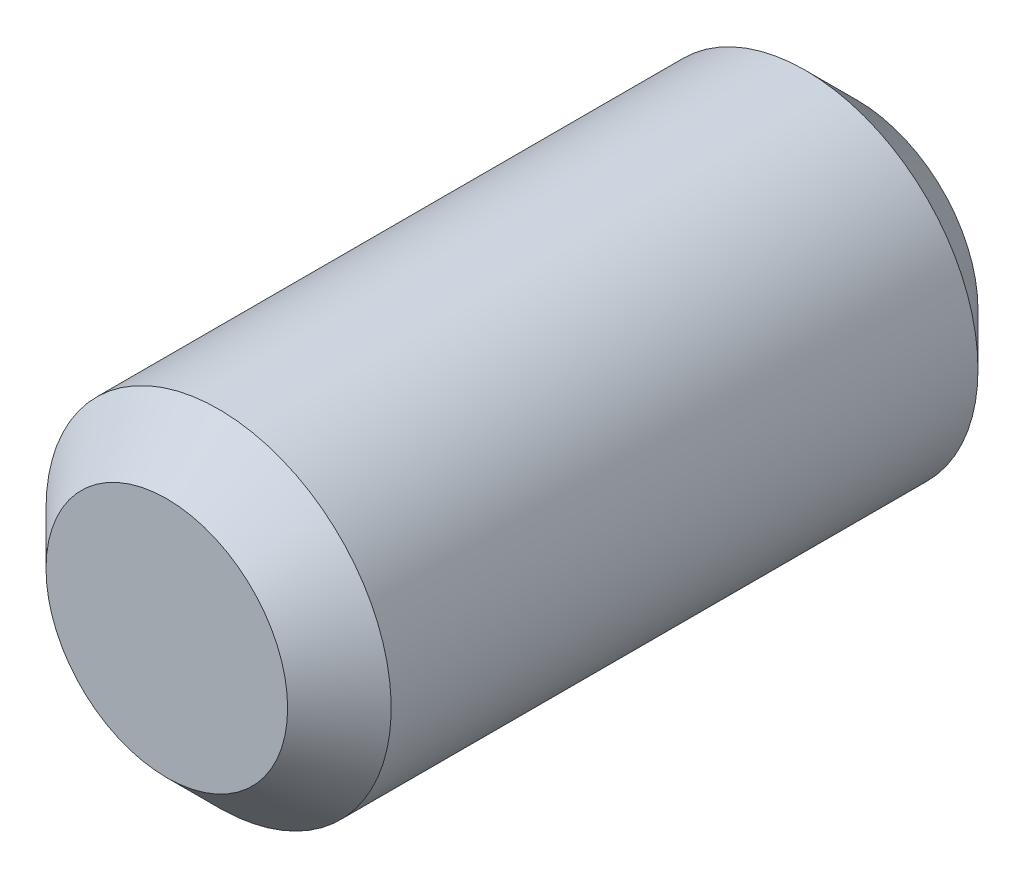
ISO-10303-21;
HEADER;
FILE_DESCRIPTION(('STEP AP214'),'2;1');
FILE_NAME('part.step','',(''),(''),'','','');
FILE_SCHEMA(('AUTOMOTIVE_DESIGN { 1 0 10303 214 1 1 1 1 }'));
ENDSEC;
DATA;
#1=APPLICATION_CONTEXT('core data for automotive mechanical design processes');
#2=APPLICATION_PROTOCOL_DEFINITION('international standard','automotive_design',2000,#1);
#3=PRODUCT_CONTEXT('',#1,'mechanical');
#4=PRODUCT('Part','Part','',(#3));
#5=PRODUCT_RELATED_PRODUCT_CATEGORY('part','',(#4));
#6=PRODUCT_DEFINITION_FORMATION('','',#4);
#7=PRODUCT_DEFINITION_CONTEXT('part definition',#1,'design');
#8=PRODUCT_DEFINITION('design','',#6,#7);
#9=PRODUCT_DEFINITION_SHAPE('','',#8);
#10=(LENGTH_UNIT() NAMED_UNIT(*) SI_UNIT(.MILLI.,.METRE.));
#11=(NAMED_UNIT(*) PLANE_ANGLE_UNIT() SI_UNIT($,.RADIAN.));
#12=(NAMED_UNIT(*) SI_UNIT($,.STERADIAN.) SOLID_ANGLE_UNIT());
#13=UNCERTAINTY_MEASURE_WITH_UNIT(LENGTH_MEASURE(1.E-05),#10,'distance_accuracy_value','');
#14=(GEOMETRIC_REPRESENTATION_CONTEXT(3) GLOBAL_UNCERTAINTY_ASSIGNED_CONTEXT((#13)) GLOBAL_UNIT_ASSIGNED_CONTEXT((#10,
#11,#12)) REPRESENTATION_CONTEXT('',''));
#15=CARTESIAN_POINT('',(0.,0.,0.));
#16=DIRECTION('',(0.,0.,1.));
#17=DIRECTION('',(1.,0.,0.));
#18=AXIS2_PLACEMENT_3D('',#15,#16,#17);
#19=CARTESIAN_POINT('',(0.,0.,4.));
#20=DIRECTION('',(0.,0.,-1.));
#21=DIRECTION('',(-1.,0.,0.));
#22=AXIS2_PLACEMENT_3D('',#19,#20,#21);
#23=CYLINDRICAL_SURFACE('',#22,1.);
#24=CARTESIAN_POINT('',(0.,0.,0.3));
#25=DIRECTION('',(0.,0.,1.));
#26=DIRECTION('',(1.,0.,0.));
#27=AXIS2_PLACEMENT_3D('',#24,#25,#26);
#28=CIRCLE('',#27,1.);
#29=CARTESIAN_POINT('',(1.,0.,0.3));
#30=VERTEX_POINT('',#29);
#31=EDGE_CURVE('E47',#30,#30,#28,.T.);
#32=ORIENTED_EDGE('',*,*,#31,.T.);
#33=EDGE_LOOP('',(#32));
#34=FACE_BOUND('',#33,.T.);
#35=CARTESIAN_POINT('',(0.,0.,3.7));
#36=DIRECTION('',(0.,0.,1.));
#37=DIRECTION('',(1.,0.,0.));
#38=AXIS2_PLACEMENT_3D('',#35,#36,#37);
#39=CIRCLE('',#38,1.);
#40=CARTESIAN_POINT('',(-1.,0.,3.7));
#41=VERTEX_POINT('',#40);
#42=EDGE_CURVE('E51',#41,#41,#39,.F.);
#43=ORIENTED_EDGE('',*,*,#42,.T.);
#44=EDGE_LOOP('',(#43));
#45=FACE_BOUND('',#44,.T.);
#46=ADVANCED_FACE('F35',(#34,#45),#23,.T.);
#47=CARTESIAN_POINT('',(0.,0.,4.));
#48=DIRECTION('',(0.,0.,1.));
#49=DIRECTION('',(1.,0.,0.));
#50=AXIS2_PLACEMENT_3D('',#47,#48,#49);
#51=PLANE('',#50);
#52=CARTESIAN_POINT('',(0.,0.,4.));
#53=DIRECTION('',(0.,0.,1.));
#54=DIRECTION('',(1.,0.,0.));
#55=AXIS2_PLACEMENT_3D('',#52,#53,#54);
#56=CIRCLE('',#55,0.700000000000001);
#57=CARTESIAN_POINT('',(-0.700000000000001,0.,4.));
#58=VERTEX_POINT('',#57);
#59=EDGE_CURVE('E10',#58,#58,#56,.T.);
#60=ORIENTED_EDGE('',*,*,#59,.T.);
#61=EDGE_LOOP('',(#60));
#62=FACE_BOUND('',#61,.T.);
#63=ADVANCED_FACE('F67',(#62),#51,.T.);
#64=CARTESIAN_POINT('',(0.,0.,0.));
#65=DIRECTION('',(0.,0.,1.));
#66=DIRECTION('',(1.,0.,0.));
#67=AXIS2_PLACEMENT_3D('',#64,#65,#66);
#68=PLANE('',#67);
#69=CARTESIAN_POINT('',(0.,0.,0.));
#70=DIRECTION('',(0.,0.,1.));
#71=DIRECTION('',(1.,0.,0.));
#72=AXIS2_PLACEMENT_3D('',#69,#70,#71);
#73=CIRCLE('',#72,0.699999999999998);
#74=CARTESIAN_POINT('',(0.699999999999998,0.,0.));
#75=VERTEX_POINT('',#74);
#76=EDGE_CURVE('E43',#75,#75,#73,.F.);
#77=ORIENTED_EDGE('',*,*,#76,.T.);
#78=EDGE_LOOP('',(#77));
#79=FACE_BOUND('',#78,.T.);
#80=ADVANCED_FACE('F64',(#79),#68,.F.);
#81=CARTESIAN_POINT('',(0.,0.,0.3));
#82=DIRECTION('',(0.,0.,1.));
#83=DIRECTION('',(1.,0.,0.));
#84=AXIS2_PLACEMENT_3D('',#81,#82,#83);
#85=CONICAL_SURFACE('',#84,1.,0.78539816339745);
#86=ORIENTED_EDGE('',*,*,#76,.F.);
#87=EDGE_LOOP('',(#86));
#88=FACE_BOUND('',#87,.T.);
#89=ORIENTED_EDGE('',*,*,#31,.F.);
#90=EDGE_LOOP('',(#89));
#91=FACE_BOUND('',#90,.T.);
#92=ADVANCED_FACE('F60',(#88,#91),#85,.T.);
#93=CARTESIAN_POINT('',(0.,0.,4.));
#94=DIRECTION('',(0.,0.,-1.));
#95=DIRECTION('',(-1.,0.,0.));
#96=AXIS2_PLACEMENT_3D('',#93,#94,#95);
#97=CONICAL_SURFACE('',#96,0.700000000000001,0.785398163397446);
#98=CARTESIAN_POINT('',(-1.,0.,3.7));
#99=CARTESIAN_POINT('',(-0.996875000000001,0.,3.703125));
#100=CARTESIAN_POINT('',(-0.99375,0.,3.70625));
#101=CARTESIAN_POINT('',(-0.9875,0.,3.7125));
#102=CARTESIAN_POINT('',(-0.984375,0.,3.715625));
#103=CARTESIAN_POINT('',(-0.978125,0.,3.721875));
#104=CARTESIAN_POINT('',(-0.975000000000001,0.,3.725));
#105=CARTESIAN_POINT('',(-0.968750000000001,0.,3.73125));
#106=CARTESIAN_POINT('',(-0.965625,0.,3.734375));
#107=CARTESIAN_POINT('',(-0.959375,0.,3.740625));
#108=CARTESIAN_POINT('',(-0.95625,0.,3.74375));
#109=CARTESIAN_POINT('',(-0.95,0.,3.75));
#110=CARTESIAN_POINT('',(-0.946875,0.,3.753125));
#111=CARTESIAN_POINT('',(-0.940625,0.,3.759375));
#112=CARTESIAN_POINT('',(-0.937500000000001,0.,3.7625));
#113=CARTESIAN_POINT('',(-0.931250000000001,0.,3.76875));
#114=CARTESIAN_POINT('',(-0.928125000000001,0.,3.771875));
#115=CARTESIAN_POINT('',(-0.921875,0.,3.778125));
#116=CARTESIAN_POINT('',(-0.918750000000001,0.,3.78125));
#117=CARTESIAN_POINT('',(-0.912500000000001,0.,3.7875));
#118=CARTESIAN_POINT('',(-0.909375000000001,0.,3.790625));
#119=CARTESIAN_POINT('',(-0.903125000000001,0.,3.796875));
#120=CARTESIAN_POINT('',(-0.900000000000001,0.,3.8));
#121=CARTESIAN_POINT('',(-0.893750000000001,0.,3.80625));
#122=CARTESIAN_POINT('',(-0.890625,0.,3.809375));
#123=CARTESIAN_POINT('',(-0.884375000000001,0.,3.815625));
#124=CARTESIAN_POINT('',(-0.881250000000001,0.,3.81875));
#125=CARTESIAN_POINT('',(-0.875000000000001,0.,3.825));
#126=CARTESIAN_POINT('',(-0.871875000000001,0.,3.828125));
#127=CARTESIAN_POINT('',(-0.865625000000001,0.,3.834375));
#128=CARTESIAN_POINT('',(-0.862500000000001,0.,3.8375));
#129=CARTESIAN_POINT('',(-0.856250000000001,0.,3.84375));
#130=CARTESIAN_POINT('',(-0.853125000000001,0.,3.846875));
#131=CARTESIAN_POINT('',(-0.846875000000001,0.,3.853125));
#132=CARTESIAN_POINT('',(-0.843750000000001,0.,3.85625));
#133=CARTESIAN_POINT('',(-0.837500000000001,0.,3.8625));
#134=CARTESIAN_POINT('',(-0.834375000000001,0.,3.865625));
#135=CARTESIAN_POINT('',(-0.828125000000001,0.,3.871875));
#136=CARTESIAN_POINT('',(-0.825000000000001,0.,3.875));
#137=CARTESIAN_POINT('',(-0.818750000000001,0.,3.88125));
#138=CARTESIAN_POINT('',(-0.815625000000001,0.,3.884375));
#139=CARTESIAN_POINT('',(-0.809375000000001,0.,3.890625));
#140=CARTESIAN_POINT('',(-0.806250000000001,0.,3.89375));
#141=CARTESIAN_POINT('',(-0.800000000000001,0.,3.9));
#142=CARTESIAN_POINT('',(-0.796875000000001,0.,3.903125));
#143=CARTESIAN_POINT('',(-0.790625000000001,0.,3.909375));
#144=CARTESIAN_POINT('',(-0.787500000000001,0.,3.9125));
#145=CARTESIAN_POINT('',(-0.781250000000001,0.,3.91875));
#146=CARTESIAN_POINT('',(-0.778125000000001,0.,3.921875));
#147=CARTESIAN_POINT('',(-0.771875000000001,0.,3.928125));
#148=CARTESIAN_POINT('',(-0.768750000000001,0.,3.93125));
#149=CARTESIAN_POINT('',(-0.762500000000001,0.,3.9375));
#150=CARTESIAN_POINT('',(-0.759375000000001,0.,3.940625));
#151=CARTESIAN_POINT('',(-0.753125000000001,0.,3.946875));
#152=CARTESIAN_POINT('',(-0.750000000000001,0.,3.95));
#153=CARTESIAN_POINT('',(-0.743750000000001,0.,3.95625));
#154=CARTESIAN_POINT('',(-0.740625000000001,0.,3.959375));
#155=CARTESIAN_POINT('',(-0.734375000000001,0.,3.965625));
#156=CARTESIAN_POINT('',(-0.731250000000001,0.,3.96875));
#157=CARTESIAN_POINT('',(-0.725000000000001,0.,3.975));
#158=CARTESIAN_POINT('',(-0.721875000000001,0.,3.978125));
#159=CARTESIAN_POINT('',(-0.715625000000001,0.,3.984375));
#160=CARTESIAN_POINT('',(-0.712500000000001,0.,3.9875));
#161=CARTESIAN_POINT('',(-0.706250000000001,0.,3.99375));
#162=CARTESIAN_POINT('',(-0.703125000000001,0.,3.996875));
#163=CARTESIAN_POINT('',(-0.700000000000001,0.,4.));
#164=B_SPLINE_CURVE_WITH_KNOTS('',3,(#98,#99,#100,#101,#102,#103,#104,#105,#106,#107,#108,#109,
#110,#111,#112,#113,#114,#115,#116,#117,#118,#119,#120,#121,#122,#123,#124,#125,#126,#127,#128,
#129,#130,#131,#132,#133,#134,#135,#136,#137,#138,#139,#140,#141,#142,#143,#144,#145,#146,#147,
#148,#149,#150,#151,#152,#153,#154,#155,#156,#157,#158,#159,#160,#161,#162,#163),.UNSPECIFIED.,
.F.,.F.,(4,2,2,2,2,2,2,2,2,2,2,2,2,2,2,2,2,2,2,2,2,2,2,2,2,2,2,2,2,2,2,2,4),(0.,
0.013258252147248,0.0265165042944957,0.0397747564417435,0.0530330085889912,0.0662912607362392,
0.0795495128834868,0.0928077650307344,0.106066017177982,0.11932426932523,0.132582521472478,
0.145840773619726,0.159099025766973,0.172357277914221,0.185615530061469,0.198873782208717,
0.212132034355964,0.225390286503212,0.23864853865046,0.251906790797708,0.265165042944956,
0.278423295092203,0.291681547239451,0.304939799386699,0.318198051533947,0.331456303681194,
0.344714555828442,0.35797280797569,0.371231060122938,0.384489312270186,0.397747564417433,
0.411005816564681,0.424264068711929),.UNSPECIFIED.);
#165=EDGE_CURVE('BSEAM38',#41,#58,#164,.T.);
#166=ORIENTED_EDGE('',*,*,#42,.F.);
#167=ORIENTED_EDGE('',*,*,#59,.F.);
#168=ORIENTED_EDGE('',*,*,#165,.T.);
#169=ORIENTED_EDGE('',*,*,#165,.F.);
#170=EDGE_LOOP('',(#166,#168,#167,#169));
#171=FACE_BOUND('',#170,.T.);
#172=ADVANCED_FACE('F38',(#171),#97,.T.);
#173=CLOSED_SHELL('',(#46,#63,#80,#92,#172));
#174=MANIFOLD_SOLID_BREP('B2',#173);
#175=ADVANCED_BREP_SHAPE_REPRESENTATION('',(#18,#174),#14);
#176=SHAPE_DEFINITION_REPRESENTATION(#9,#175);
ENDSEC;
END-ISO-10303-21;
